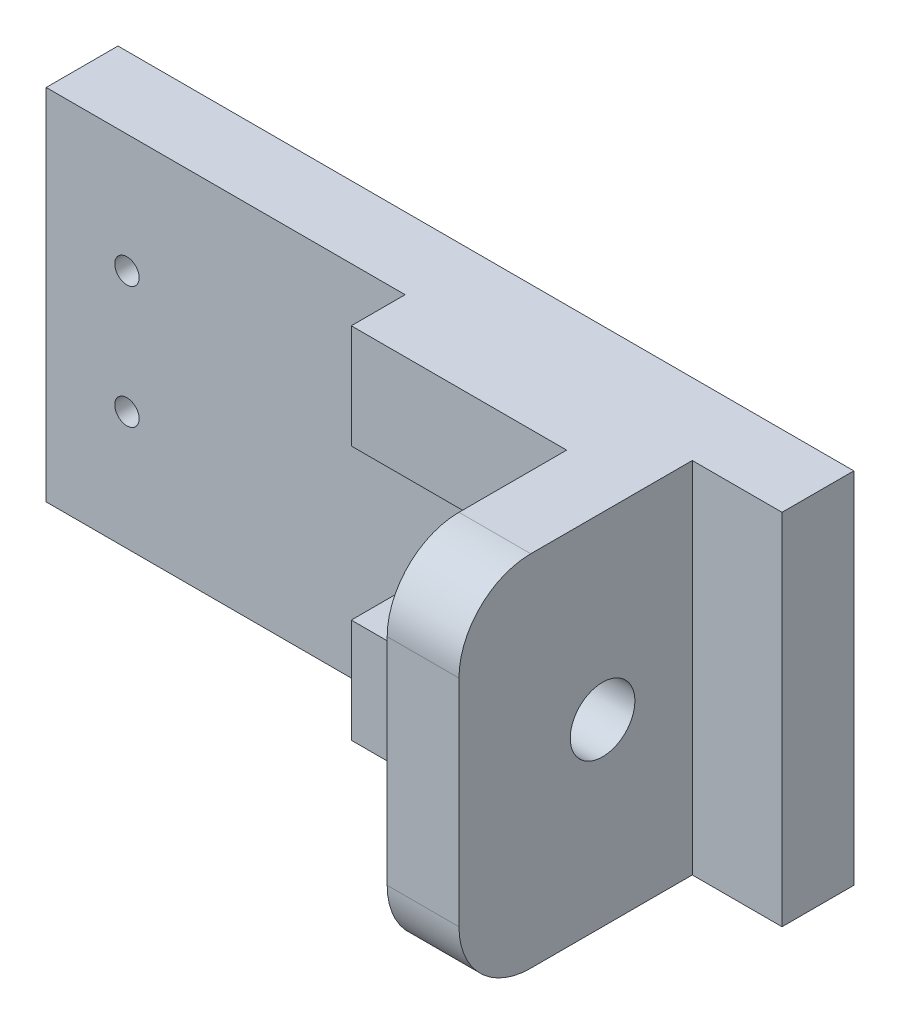
ISO-10303-21;
HEADER;
FILE_DESCRIPTION(('STEP AP214'),'2;1');
FILE_NAME('part.step','',(''),(''),'','','');
FILE_SCHEMA(('AUTOMOTIVE_DESIGN { 1 0 10303 214 1 1 1 1 }'));
ENDSEC;
DATA;
#1=APPLICATION_CONTEXT('core data for automotive mechanical design processes');
#2=APPLICATION_PROTOCOL_DEFINITION('international standard','automotive_design',2000,#1);
#3=PRODUCT_CONTEXT('',#1,'mechanical');
#4=PRODUCT('Part','Part','',(#3));
#5=PRODUCT_RELATED_PRODUCT_CATEGORY('part','',(#4));
#6=PRODUCT_DEFINITION_FORMATION('','',#4);
#7=PRODUCT_DEFINITION_CONTEXT('part definition',#1,'design');
#8=PRODUCT_DEFINITION('design','',#6,#7);
#9=PRODUCT_DEFINITION_SHAPE('','',#8);
#10=(LENGTH_UNIT() NAMED_UNIT(*) SI_UNIT(.MILLI.,.METRE.));
#11=(NAMED_UNIT(*) PLANE_ANGLE_UNIT() SI_UNIT($,.RADIAN.));
#12=(NAMED_UNIT(*) SI_UNIT($,.STERADIAN.) SOLID_ANGLE_UNIT());
#13=UNCERTAINTY_MEASURE_WITH_UNIT(LENGTH_MEASURE(1.E-05),#10,'distance_accuracy_value','');
#14=(GEOMETRIC_REPRESENTATION_CONTEXT(3) GLOBAL_UNCERTAINTY_ASSIGNED_CONTEXT((#13)) GLOBAL_UNIT_ASSIGNED_CONTEXT((#10,
#11,#12)) REPRESENTATION_CONTEXT('',''));
#15=CARTESIAN_POINT('',(0.,0.,0.));
#16=DIRECTION('',(0.,0.,1.));
#17=DIRECTION('',(1.,0.,0.));
#18=AXIS2_PLACEMENT_3D('',#15,#16,#17);
#19=CARTESIAN_POINT('',(0.,0.,20.));
#20=DIRECTION('',(0.,0.,1.));
#21=DIRECTION('',(1.,0.,0.));
#22=AXIS2_PLACEMENT_3D('',#19,#20,#21);
#23=PLANE('',#22);
#24=CARTESIAN_POINT('',(-80.,17.,20.));
#25=DIRECTION('',(0.,0.,1.));
#26=DIRECTION('',(1.,0.,0.));
#27=AXIS2_PLACEMENT_3D('',#24,#25,#26);
#28=CIRCLE('',#27,3.39999999999999);
#29=CARTESIAN_POINT('',(-76.6,17.,20.));
#30=VERTEX_POINT('',#29);
#31=EDGE_CURVE('E356',#30,#30,#28,.T.);
#32=ORIENTED_EDGE('',*,*,#31,.F.);
#33=EDGE_LOOP('',(#32));
#34=FACE_BOUND('',#33,.T.);
#35=CARTESIAN_POINT('',(-80.,-17.,20.));
#36=DIRECTION('',(0.,0.,1.));
#37=DIRECTION('',(1.,0.,0.));
#38=AXIS2_PLACEMENT_3D('',#35,#36,#37);
#39=CIRCLE('',#38,3.39999999999999);
#40=CARTESIAN_POINT('',(-76.6,-17.,20.));
#41=VERTEX_POINT('',#40);
#42=EDGE_CURVE('E359',#41,#41,#39,.T.);
#43=ORIENTED_EDGE('',*,*,#42,.F.);
#44=EDGE_LOOP('',(#43));
#45=FACE_BOUND('',#44,.T.);
#46=DIRECTION('',(1.,0.,0.));
#47=VECTOR('',#46,1.);
#48=CARTESIAN_POINT('',(57.5,21.,20.));
#49=LINE('',#48,#47);
#50=CARTESIAN_POINT('',(-2.49999999999997,21.,20.));
#51=VERTEX_POINT('',#50);
#52=CARTESIAN_POINT('',(57.5,21.,20.));
#53=VERTEX_POINT('',#52);
#54=EDGE_CURVE('E57',#51,#53,#49,.T.);
#55=ORIENTED_EDGE('',*,*,#54,.F.);
#56=DIRECTION('',(0.,-1.,0.));
#57=VECTOR('',#56,1.);
#58=CARTESIAN_POINT('',(-2.49999999999997,50.,20.));
#59=LINE('',#58,#57);
#60=CARTESIAN_POINT('',(-2.49999999999997,50.,20.));
#61=VERTEX_POINT('',#60);
#62=EDGE_CURVE('E183',#61,#51,#59,.T.);
#63=ORIENTED_EDGE('',*,*,#62,.F.);
#64=DIRECTION('',(-1.,0.,0.));
#65=VECTOR('',#64,1.);
#66=CARTESIAN_POINT('',(102.5,50.,20.));
#67=LINE('',#66,#65);
#68=CARTESIAN_POINT('',(-102.5,50.,20.));
#69=VERTEX_POINT('',#68);
#70=EDGE_CURVE('E169',#61,#69,#67,.T.);
#71=ORIENTED_EDGE('',*,*,#70,.T.);
#72=DIRECTION('',(0.,-1.,0.));
#73=VECTOR('',#72,1.);
#74=CARTESIAN_POINT('',(-102.5,-50.,20.));
#75=LINE('',#74,#73);
#76=CARTESIAN_POINT('',(-102.5,-50.,20.));
#77=VERTEX_POINT('',#76);
#78=EDGE_CURVE('E257',#69,#77,#75,.T.);
#79=ORIENTED_EDGE('',*,*,#78,.T.);
#80=DIRECTION('',(1.,0.,0.));
#81=VECTOR('',#80,1.);
#82=CARTESIAN_POINT('',(102.5,-50.,20.));
#83=LINE('',#82,#81);
#84=CARTESIAN_POINT('',(-2.49999999999999,-50.,20.));
#85=VERTEX_POINT('',#84);
#86=EDGE_CURVE('E262',#77,#85,#83,.T.);
#87=ORIENTED_EDGE('',*,*,#86,.T.);
#88=DIRECTION('',(0.,-1.,0.));
#89=VECTOR('',#88,1.);
#90=CARTESIAN_POINT('',(-2.49999999999999,-50.,20.));
#91=LINE('',#90,#89);
#92=CARTESIAN_POINT('',(-2.49999999999999,-21.,20.));
#93=VERTEX_POINT('',#92);
#94=EDGE_CURVE('E193',#93,#85,#91,.T.);
#95=ORIENTED_EDGE('',*,*,#94,.F.);
#96=DIRECTION('',(-1.,0.,0.));
#97=VECTOR('',#96,1.);
#98=CARTESIAN_POINT('',(57.5,-21.,20.));
#99=LINE('',#98,#97);
#100=CARTESIAN_POINT('',(57.5,-21.,20.));
#101=VERTEX_POINT('',#100);
#102=EDGE_CURVE('E171',#101,#93,#99,.T.);
#103=ORIENTED_EDGE('',*,*,#102,.F.);
#104=DIRECTION('',(0.,-1.,0.));
#105=VECTOR('',#104,1.);
#106=CARTESIAN_POINT('',(57.5,-50.,20.));
#107=LINE('',#106,#105);
#108=EDGE_CURVE('E226',#53,#101,#107,.T.);
#109=ORIENTED_EDGE('',*,*,#108,.F.);
#110=EDGE_LOOP('',(#55,#63,#71,#79,#87,#95,#103,#109));
#111=FACE_BOUND('',#110,.T.);
#112=ADVANCED_FACE('F42',(#34,#45,#111),#23,.T.);
#113=CARTESIAN_POINT('',(57.5,-50.,85.));
#114=DIRECTION('',(1.,0.,0.));
#115=DIRECTION('',(0.,0.,-1.));
#116=AXIS2_PLACEMENT_3D('',#113,#114,#115);
#117=PLANE('',#116);
#118=CARTESIAN_POINT('',(57.5,0.,45.));
#119=DIRECTION('',(-1.,0.,0.));
#120=DIRECTION('',(0.,0.,1.));
#121=AXIS2_PLACEMENT_3D('',#118,#119,#120);
#122=CIRCLE('',#121,9.);
#123=CARTESIAN_POINT('',(57.5,0.,54.));
#124=VERTEX_POINT('',#123);
#125=EDGE_CURVE('E210',#124,#124,#122,.T.);
#126=ORIENTED_EDGE('',*,*,#125,.F.);
#127=EDGE_LOOP('',(#126));
#128=FACE_BOUND('',#127,.T.);
#129=DIRECTION('',(0.,0.,-1.));
#130=VECTOR('',#129,1.);
#131=CARTESIAN_POINT('',(57.5,21.,35.));
#132=LINE('',#131,#130);
#133=CARTESIAN_POINT('',(57.5,21.,35.));
#134=VERTEX_POINT('',#133);
#135=EDGE_CURVE('E179',#134,#53,#132,.T.);
#136=ORIENTED_EDGE('',*,*,#135,.T.);
#137=ORIENTED_EDGE('',*,*,#108,.T.);
#138=DIRECTION('',(0.,0.,-1.));
#139=VECTOR('',#138,1.);
#140=CARTESIAN_POINT('',(57.5,-21.,35.));
#141=LINE('',#140,#139);
#142=CARTESIAN_POINT('',(57.5,-21.,35.));
#143=VERTEX_POINT('',#142);
#144=EDGE_CURVE('E207',#143,#101,#141,.T.);
#145=ORIENTED_EDGE('',*,*,#144,.F.);
#146=DIRECTION('',(0.,1.,0.));
#147=VECTOR('',#146,1.);
#148=CARTESIAN_POINT('',(57.5,-50.,35.));
#149=LINE('',#148,#147);
#150=CARTESIAN_POINT('',(57.5,-50.,35.));
#151=VERTEX_POINT('',#150);
#152=EDGE_CURVE('E189',#151,#143,#149,.T.);
#153=ORIENTED_EDGE('',*,*,#152,.F.);
#154=DIRECTION('',(0.,0.,-1.));
#155=VECTOR('',#154,1.);
#156=CARTESIAN_POINT('',(57.5,-50.,85.));
#157=LINE('',#156,#155);
#158=CARTESIAN_POINT('',(57.5,-50.,65.));
#159=VERTEX_POINT('',#158);
#160=EDGE_CURVE('E253',#159,#151,#157,.T.);
#161=ORIENTED_EDGE('',*,*,#160,.F.);
#162=CARTESIAN_POINT('',(57.5,-30.,65.));
#163=DIRECTION('',(1.,0.,0.));
#164=DIRECTION('',(0.,0.,1.));
#165=AXIS2_PLACEMENT_3D('',#162,#163,#164);
#166=CIRCLE('',#165,20.);
#167=CARTESIAN_POINT('',(57.5,-30.,85.));
#168=VERTEX_POINT('',#167);
#169=EDGE_CURVE('E214',#168,#159,#166,.T.);
#170=ORIENTED_EDGE('',*,*,#169,.F.);
#171=DIRECTION('',(0.,-1.,0.));
#172=VECTOR('',#171,1.);
#173=CARTESIAN_POINT('',(57.5,-50.,85.));
#174=LINE('',#173,#172);
#175=CARTESIAN_POINT('',(57.5,30.,85.));
#176=VERTEX_POINT('',#175);
#177=EDGE_CURVE('E237',#176,#168,#174,.T.);
#178=ORIENTED_EDGE('',*,*,#177,.F.);
#179=CARTESIAN_POINT('',(57.5,30.,65.));
#180=DIRECTION('',(1.,0.,0.));
#181=DIRECTION('',(0.,0.,1.));
#182=AXIS2_PLACEMENT_3D('',#179,#180,#181);
#183=CIRCLE('',#182,20.);
#184=CARTESIAN_POINT('',(57.5,50.,65.));
#185=VERTEX_POINT('',#184);
#186=EDGE_CURVE('E221',#185,#176,#183,.T.);
#187=ORIENTED_EDGE('',*,*,#186,.F.);
#188=DIRECTION('',(0.,0.,-1.));
#189=VECTOR('',#188,1.);
#190=CARTESIAN_POINT('',(57.5,50.,85.));
#191=LINE('',#190,#189);
#192=CARTESIAN_POINT('',(57.5,50.,35.));
#193=VERTEX_POINT('',#192);
#194=EDGE_CURVE('E244',#185,#193,#191,.T.);
#195=ORIENTED_EDGE('',*,*,#194,.T.);
#196=DIRECTION('',(0.,1.,0.));
#197=VECTOR('',#196,1.);
#198=CARTESIAN_POINT('',(57.5,50.,35.));
#199=LINE('',#198,#197);
#200=EDGE_CURVE('E65',#134,#193,#199,.T.);
#201=ORIENTED_EDGE('',*,*,#200,.F.);
#202=EDGE_LOOP('',(#136,#137,#145,#153,#161,#170,#178,#187,#195,#201));
#203=FACE_BOUND('',#202,.T.);
#204=ADVANCED_FACE('F303',(#128,#203),#117,.F.);
#205=CARTESIAN_POINT('',(102.5,-50.,20.));
#206=DIRECTION('',(0.,1.,0.));
#207=DIRECTION('',(-1.,0.,0.));
#208=AXIS2_PLACEMENT_3D('',#205,#206,#207);
#209=PLANE('',#208);
#210=DIRECTION('',(-1.,0.,0.));
#211=VECTOR('',#210,1.);
#212=CARTESIAN_POINT('',(77.5,-50.,65.));
#213=LINE('',#212,#211);
#214=CARTESIAN_POINT('',(77.5,-50.,65.));
#215=VERTEX_POINT('',#214);
#216=EDGE_CURVE('E232',#215,#159,#213,.T.);
#217=ORIENTED_EDGE('',*,*,#216,.T.);
#218=ORIENTED_EDGE('',*,*,#160,.T.);
#219=DIRECTION('',(1.,0.,0.));
#220=VECTOR('',#219,1.);
#221=CARTESIAN_POINT('',(57.5,-50.,35.));
#222=LINE('',#221,#220);
#223=CARTESIAN_POINT('',(-2.49999999999999,-50.,35.));
#224=VERTEX_POINT('',#223);
#225=EDGE_CURVE('E197',#224,#151,#222,.T.);
#226=ORIENTED_EDGE('',*,*,#225,.F.);
#227=DIRECTION('',(0.,0.,-1.));
#228=VECTOR('',#227,1.);
#229=CARTESIAN_POINT('',(-2.49999999999999,-50.,35.));
#230=LINE('',#229,#228);
#231=EDGE_CURVE('E199',#224,#85,#230,.T.);
#232=ORIENTED_EDGE('',*,*,#231,.T.);
#233=ORIENTED_EDGE('',*,*,#86,.F.);
#234=DIRECTION('',(0.,0.,-1.));
#235=VECTOR('',#234,1.);
#236=CARTESIAN_POINT('',(-102.5,-50.,20.));
#237=LINE('',#236,#235);
#238=CARTESIAN_POINT('',(-102.5,-50.,0.));
#239=VERTEX_POINT('',#238);
#240=EDGE_CURVE('E11',#77,#239,#237,.T.);
#241=ORIENTED_EDGE('',*,*,#240,.T.);
#242=DIRECTION('',(1.,0.,0.));
#243=VECTOR('',#242,1.);
#244=CARTESIAN_POINT('',(102.5,-50.,0.));
#245=LINE('',#244,#243);
#246=CARTESIAN_POINT('',(102.5,-50.,0.));
#247=VERTEX_POINT('',#246);
#248=EDGE_CURVE('E273',#239,#247,#245,.T.);
#249=ORIENTED_EDGE('',*,*,#248,.T.);
#250=DIRECTION('',(0.,0.,-1.));
#251=VECTOR('',#250,1.);
#252=CARTESIAN_POINT('',(102.5,-50.,20.));
#253=LINE('',#252,#251);
#254=CARTESIAN_POINT('',(102.5,-50.,20.));
#255=VERTEX_POINT('',#254);
#256=EDGE_CURVE('E50',#255,#247,#253,.T.);
#257=ORIENTED_EDGE('',*,*,#256,.F.);
#258=CARTESIAN_POINT('',(77.5,-50.,20.));
#259=VERTEX_POINT('',#258);
#260=EDGE_CURVE('E260',#259,#255,#83,.T.);
#261=ORIENTED_EDGE('',*,*,#260,.F.);
#262=DIRECTION('',(0.,0.,-1.));
#263=VECTOR('',#262,1.);
#264=CARTESIAN_POINT('',(77.5,-50.,85.));
#265=LINE('',#264,#263);
#266=EDGE_CURVE('E251',#215,#259,#265,.T.);
#267=ORIENTED_EDGE('',*,*,#266,.F.);
#268=EDGE_LOOP('',(#217,#218,#226,#232,#233,#241,#249,#257,#261,#267));
#269=FACE_BOUND('',#268,.T.);
#270=ADVANCED_FACE('F319',(#269),#209,.F.);
#271=CARTESIAN_POINT('',(0.,0.,85.));
#272=DIRECTION('',(0.,0.,1.));
#273=DIRECTION('',(1.,0.,0.));
#274=AXIS2_PLACEMENT_3D('',#271,#272,#273);
#275=PLANE('',#274);
#276=DIRECTION('',(-1.,0.,0.));
#277=VECTOR('',#276,1.);
#278=CARTESIAN_POINT('',(77.5,30.,85.));
#279=LINE('',#278,#277);
#280=CARTESIAN_POINT('',(77.5,30.,85.));
#281=VERTEX_POINT('',#280);
#282=EDGE_CURVE('E220',#281,#176,#279,.T.);
#283=ORIENTED_EDGE('',*,*,#282,.T.);
#284=ORIENTED_EDGE('',*,*,#177,.T.);
#285=DIRECTION('',(-1.,0.,0.));
#286=VECTOR('',#285,1.);
#287=CARTESIAN_POINT('',(77.5,-30.,85.));
#288=LINE('',#287,#286);
#289=CARTESIAN_POINT('',(77.5,-30.,85.));
#290=VERTEX_POINT('',#289);
#291=EDGE_CURVE('E223',#290,#168,#288,.T.);
#292=ORIENTED_EDGE('',*,*,#291,.F.);
#293=DIRECTION('',(0.,1.,0.));
#294=VECTOR('',#293,1.);
#295=CARTESIAN_POINT('',(77.5,-50.,85.));
#296=LINE('',#295,#294);
#297=EDGE_CURVE('E240',#290,#281,#296,.T.);
#298=ORIENTED_EDGE('',*,*,#297,.T.);
#299=EDGE_LOOP('',(#283,#284,#292,#298));
#300=FACE_BOUND('',#299,.T.);
#301=ADVANCED_FACE('F330',(#300),#275,.T.);
#302=CARTESIAN_POINT('',(-102.5,-50.,20.));
#303=DIRECTION('',(1.,0.,0.));
#304=DIRECTION('',(0.,0.,-1.));
#305=AXIS2_PLACEMENT_3D('',#302,#303,#304);
#306=PLANE('',#305);
#307=DIRECTION('',(0.,-1.,0.));
#308=VECTOR('',#307,1.);
#309=CARTESIAN_POINT('',(-102.5,-50.,0.));
#310=LINE('',#309,#308);
#311=CARTESIAN_POINT('',(-102.5,50.,0.));
#312=VERTEX_POINT('',#311);
#313=EDGE_CURVE('E256',#312,#239,#310,.T.);
#314=ORIENTED_EDGE('',*,*,#313,.T.);
#315=ORIENTED_EDGE('',*,*,#240,.F.);
#316=ORIENTED_EDGE('',*,*,#78,.F.);
#317=DIRECTION('',(0.,0.,-1.));
#318=VECTOR('',#317,1.);
#319=CARTESIAN_POINT('',(-102.5,50.,20.));
#320=LINE('',#319,#318);
#321=EDGE_CURVE('E270',#69,#312,#320,.T.);
#322=ORIENTED_EDGE('',*,*,#321,.T.);
#323=EDGE_LOOP('',(#314,#315,#316,#322));
#324=FACE_BOUND('',#323,.T.);
#325=ADVANCED_FACE('F44',(#324),#306,.F.);
#326=CARTESIAN_POINT('',(102.5,-50.,20.));
#327=DIRECTION('',(-1.,0.,0.));
#328=DIRECTION('',(0.,0.,1.));
#329=AXIS2_PLACEMENT_3D('',#326,#327,#328);
#330=PLANE('',#329);
#331=DIRECTION('',(0.,1.,0.));
#332=VECTOR('',#331,1.);
#333=CARTESIAN_POINT('',(102.5,-50.,0.));
#334=LINE('',#333,#332);
#335=CARTESIAN_POINT('',(102.5,50.,0.));
#336=VERTEX_POINT('',#335);
#337=EDGE_CURVE('E275',#247,#336,#334,.T.);
#338=ORIENTED_EDGE('',*,*,#337,.T.);
#339=DIRECTION('',(0.,0.,-1.));
#340=VECTOR('',#339,1.);
#341=CARTESIAN_POINT('',(102.5,50.,20.));
#342=LINE('',#341,#340);
#343=CARTESIAN_POINT('',(102.5,50.,20.));
#344=VERTEX_POINT('',#343);
#345=EDGE_CURVE('E280',#344,#336,#342,.T.);
#346=ORIENTED_EDGE('',*,*,#345,.F.);
#347=DIRECTION('',(0.,1.,0.));
#348=VECTOR('',#347,1.);
#349=CARTESIAN_POINT('',(102.5,-50.,20.));
#350=LINE('',#349,#348);
#351=EDGE_CURVE('E265',#255,#344,#350,.T.);
#352=ORIENTED_EDGE('',*,*,#351,.F.);
#353=ORIENTED_EDGE('',*,*,#256,.T.);
#354=EDGE_LOOP('',(#338,#346,#352,#353));
#355=FACE_BOUND('',#354,.T.);
#356=ADVANCED_FACE('F287',(#355),#330,.F.);
#357=CARTESIAN_POINT('',(102.5,50.,20.));
#358=DIRECTION('',(0.,-1.,0.));
#359=DIRECTION('',(1.,0.,0.));
#360=AXIS2_PLACEMENT_3D('',#357,#358,#359);
#361=PLANE('',#360);
#362=ORIENTED_EDGE('',*,*,#194,.F.);
#363=DIRECTION('',(-1.,0.,0.));
#364=VECTOR('',#363,1.);
#365=CARTESIAN_POINT('',(77.5,50.,65.));
#366=LINE('',#365,#364);
#367=CARTESIAN_POINT('',(77.5,50.,65.));
#368=VERTEX_POINT('',#367);
#369=EDGE_CURVE('E224',#368,#185,#366,.T.);
#370=ORIENTED_EDGE('',*,*,#369,.F.);
#371=DIRECTION('',(0.,0.,-1.));
#372=VECTOR('',#371,1.);
#373=CARTESIAN_POINT('',(77.5,50.,85.));
#374=LINE('',#373,#372);
#375=CARTESIAN_POINT('',(77.5,50.,20.));
#376=VERTEX_POINT('',#375);
#377=EDGE_CURVE('E249',#368,#376,#374,.T.);
#378=ORIENTED_EDGE('',*,*,#377,.T.);
#379=EDGE_CURVE('E267',#344,#376,#67,.T.);
#380=ORIENTED_EDGE('',*,*,#379,.F.);
#381=ORIENTED_EDGE('',*,*,#345,.T.);
#382=DIRECTION('',(-1.,0.,0.));
#383=VECTOR('',#382,1.);
#384=CARTESIAN_POINT('',(102.5,50.,0.));
#385=LINE('',#384,#383);
#386=EDGE_CURVE('E261',#336,#312,#385,.T.);
#387=ORIENTED_EDGE('',*,*,#386,.T.);
#388=ORIENTED_EDGE('',*,*,#321,.F.);
#389=ORIENTED_EDGE('',*,*,#70,.F.);
#390=DIRECTION('',(0.,0.,-1.));
#391=VECTOR('',#390,1.);
#392=CARTESIAN_POINT('',(-2.49999999999997,50.,35.));
#393=LINE('',#392,#391);
#394=CARTESIAN_POINT('',(-2.49999999999997,50.,35.));
#395=VERTEX_POINT('',#394);
#396=EDGE_CURVE('E166',#395,#61,#393,.T.);
#397=ORIENTED_EDGE('',*,*,#396,.F.);
#398=DIRECTION('',(-1.,0.,0.));
#399=VECTOR('',#398,1.);
#400=CARTESIAN_POINT('',(57.5,50.,35.));
#401=LINE('',#400,#399);
#402=EDGE_CURVE('E156',#193,#395,#401,.T.);
#403=ORIENTED_EDGE('',*,*,#402,.F.);
#404=EDGE_LOOP('',(#362,#370,#378,#380,#381,#387,#388,#389,#397,#403));
#405=FACE_BOUND('',#404,.T.);
#406=ADVANCED_FACE('F167',(#405),#361,.F.);
#407=DIRECTION('',(0.,1.,0.));
#408=VECTOR('',#407,1.);
#409=CARTESIAN_POINT('',(77.5,-50.,20.));
#410=LINE('',#409,#408);
#411=EDGE_CURVE('E241',#259,#376,#410,.T.);
#412=ORIENTED_EDGE('',*,*,#411,.F.);
#413=ORIENTED_EDGE('',*,*,#260,.T.);
#414=ORIENTED_EDGE('',*,*,#351,.T.);
#415=ORIENTED_EDGE('',*,*,#379,.T.);
#416=EDGE_LOOP('',(#412,#413,#414,#415));
#417=FACE_BOUND('',#416,.T.);
#418=ADVANCED_FACE('F336',(#417),#23,.T.);
#419=CARTESIAN_POINT('',(0.,0.,0.));
#420=DIRECTION('',(0.,0.,1.));
#421=DIRECTION('',(1.,0.,0.));
#422=AXIS2_PLACEMENT_3D('',#419,#420,#421);
#423=PLANE('',#422);
#424=CARTESIAN_POINT('',(-80.,17.,0.));
#425=DIRECTION('',(0.,0.,1.));
#426=DIRECTION('',(1.,0.,0.));
#427=AXIS2_PLACEMENT_3D('',#424,#425,#426);
#428=CIRCLE('',#427,3.39999999999999);
#429=CARTESIAN_POINT('',(-76.6,17.,0.));
#430=VERTEX_POINT('',#429);
#431=EDGE_CURVE('E361',#430,#430,#428,.T.);
#432=ORIENTED_EDGE('',*,*,#431,.T.);
#433=EDGE_LOOP('',(#432));
#434=FACE_BOUND('',#433,.T.);
#435=CARTESIAN_POINT('',(-80.,-17.,0.));
#436=DIRECTION('',(0.,0.,1.));
#437=DIRECTION('',(1.,0.,0.));
#438=AXIS2_PLACEMENT_3D('',#435,#436,#437);
#439=CIRCLE('',#438,3.39999999999999);
#440=CARTESIAN_POINT('',(-76.6,-17.,0.));
#441=VERTEX_POINT('',#440);
#442=EDGE_CURVE('E185',#441,#441,#439,.T.);
#443=ORIENTED_EDGE('',*,*,#442,.T.);
#444=EDGE_LOOP('',(#443));
#445=FACE_BOUND('',#444,.T.);
#446=ORIENTED_EDGE('',*,*,#313,.F.);
#447=ORIENTED_EDGE('',*,*,#386,.F.);
#448=ORIENTED_EDGE('',*,*,#337,.F.);
#449=ORIENTED_EDGE('',*,*,#248,.F.);
#450=EDGE_LOOP('',(#446,#447,#448,#449));
#451=FACE_BOUND('',#450,.T.);
#452=ADVANCED_FACE('F294',(#434,#445,#451),#423,.F.);
#453=CARTESIAN_POINT('',(77.5,-50.,85.));
#454=DIRECTION('',(-1.,0.,0.));
#455=DIRECTION('',(0.,0.,1.));
#456=AXIS2_PLACEMENT_3D('',#453,#454,#455);
#457=PLANE('',#456);
#458=CARTESIAN_POINT('',(77.5,0.,45.));
#459=DIRECTION('',(-1.,0.,0.));
#460=DIRECTION('',(0.,0.,1.));
#461=AXIS2_PLACEMENT_3D('',#458,#459,#460);
#462=CIRCLE('',#461,9.);
#463=CARTESIAN_POINT('',(77.5,0.,54.));
#464=VERTEX_POINT('',#463);
#465=EDGE_CURVE('E211',#464,#464,#462,.T.);
#466=ORIENTED_EDGE('',*,*,#465,.T.);
#467=EDGE_LOOP('',(#466));
#468=FACE_BOUND('',#467,.T.);
#469=ORIENTED_EDGE('',*,*,#377,.F.);
#470=CARTESIAN_POINT('',(77.5,30.,65.));
#471=DIRECTION('',(1.,0.,0.));
#472=DIRECTION('',(0.,0.,1.));
#473=AXIS2_PLACEMENT_3D('',#470,#471,#472);
#474=CIRCLE('',#473,20.);
#475=EDGE_CURVE('E217',#368,#281,#474,.T.);
#476=ORIENTED_EDGE('',*,*,#475,.T.);
#477=ORIENTED_EDGE('',*,*,#297,.F.);
#478=CARTESIAN_POINT('',(77.5,-30.,65.));
#479=DIRECTION('',(1.,0.,0.));
#480=DIRECTION('',(0.,0.,1.));
#481=AXIS2_PLACEMENT_3D('',#478,#479,#480);
#482=CIRCLE('',#481,20.);
#483=EDGE_CURVE('E229',#290,#215,#482,.T.);
#484=ORIENTED_EDGE('',*,*,#483,.T.);
#485=ORIENTED_EDGE('',*,*,#266,.T.);
#486=ORIENTED_EDGE('',*,*,#411,.T.);
#487=EDGE_LOOP('',(#469,#476,#477,#484,#485,#486));
#488=FACE_BOUND('',#487,.T.);
#489=ADVANCED_FACE('F327',(#468,#488),#457,.F.);
#490=CARTESIAN_POINT('',(77.5,-30.,65.));
#491=DIRECTION('',(-1.,0.,0.));
#492=DIRECTION('',(0.,0.,1.));
#493=AXIS2_PLACEMENT_3D('',#490,#491,#492);
#494=CYLINDRICAL_SURFACE('',#493,20.);
#495=ORIENTED_EDGE('',*,*,#169,.T.);
#496=ORIENTED_EDGE('',*,*,#216,.F.);
#497=ORIENTED_EDGE('',*,*,#483,.F.);
#498=ORIENTED_EDGE('',*,*,#291,.T.);
#499=EDGE_LOOP('',(#495,#496,#497,#498));
#500=FACE_BOUND('',#499,.T.);
#501=ADVANCED_FACE('F322',(#500),#494,.T.);
#502=CARTESIAN_POINT('',(77.5,30.,65.));
#503=DIRECTION('',(-1.,0.,0.));
#504=DIRECTION('',(0.,0.,1.));
#505=AXIS2_PLACEMENT_3D('',#502,#503,#504);
#506=CYLINDRICAL_SURFACE('',#505,20.);
#507=ORIENTED_EDGE('',*,*,#186,.T.);
#508=ORIENTED_EDGE('',*,*,#282,.F.);
#509=ORIENTED_EDGE('',*,*,#475,.F.);
#510=ORIENTED_EDGE('',*,*,#369,.T.);
#511=EDGE_LOOP('',(#507,#508,#509,#510));
#512=FACE_BOUND('',#511,.T.);
#513=ADVANCED_FACE('F396',(#512),#506,.T.);
#514=CARTESIAN_POINT('',(77.5,0.,45.));
#515=DIRECTION('',(-1.,0.,0.));
#516=DIRECTION('',(0.,0.,1.));
#517=AXIS2_PLACEMENT_3D('',#514,#515,#516);
#518=CYLINDRICAL_SURFACE('',#517,9.);
#519=ORIENTED_EDGE('',*,*,#465,.F.);
#520=EDGE_LOOP('',(#519));
#521=FACE_BOUND('',#520,.T.);
#522=ORIENTED_EDGE('',*,*,#125,.T.);
#523=EDGE_LOOP('',(#522));
#524=FACE_BOUND('',#523,.T.);
#525=ADVANCED_FACE('F393',(#521,#524),#518,.F.);
#526=CARTESIAN_POINT('',(57.5,-21.,35.));
#527=DIRECTION('',(0.,-1.,0.));
#528=DIRECTION('',(1.,0.,0.));
#529=AXIS2_PLACEMENT_3D('',#526,#527,#528);
#530=PLANE('',#529);
#531=ORIENTED_EDGE('',*,*,#102,.T.);
#532=DIRECTION('',(0.,0.,-1.));
#533=VECTOR('',#532,1.);
#534=CARTESIAN_POINT('',(-2.49999999999999,-21.,35.));
#535=LINE('',#534,#533);
#536=CARTESIAN_POINT('',(-2.49999999999999,-21.,35.));
#537=VERTEX_POINT('',#536);
#538=EDGE_CURVE('E204',#537,#93,#535,.T.);
#539=ORIENTED_EDGE('',*,*,#538,.F.);
#540=DIRECTION('',(-1.,0.,0.));
#541=VECTOR('',#540,1.);
#542=CARTESIAN_POINT('',(57.5,-21.,35.));
#543=LINE('',#542,#541);
#544=EDGE_CURVE('E192',#143,#537,#543,.T.);
#545=ORIENTED_EDGE('',*,*,#544,.F.);
#546=ORIENTED_EDGE('',*,*,#144,.T.);
#547=EDGE_LOOP('',(#531,#539,#545,#546));
#548=FACE_BOUND('',#547,.T.);
#549=ADVANCED_FACE('F308',(#548),#530,.F.);
#550=CARTESIAN_POINT('',(-2.49999999999999,-50.,35.));
#551=DIRECTION('',(1.,0.,0.));
#552=DIRECTION('',(0.,0.,-1.));
#553=AXIS2_PLACEMENT_3D('',#550,#551,#552);
#554=PLANE('',#553);
#555=ORIENTED_EDGE('',*,*,#94,.T.);
#556=ORIENTED_EDGE('',*,*,#231,.F.);
#557=DIRECTION('',(0.,-1.,0.));
#558=VECTOR('',#557,1.);
#559=CARTESIAN_POINT('',(-2.49999999999999,-50.,35.));
#560=LINE('',#559,#558);
#561=EDGE_CURVE('E195',#537,#224,#560,.T.);
#562=ORIENTED_EDGE('',*,*,#561,.F.);
#563=ORIENTED_EDGE('',*,*,#538,.T.);
#564=EDGE_LOOP('',(#555,#556,#562,#563));
#565=FACE_BOUND('',#564,.T.);
#566=ADVANCED_FACE('F311',(#565),#554,.F.);
#567=CARTESIAN_POINT('',(0.,0.,35.));
#568=DIRECTION('',(0.,0.,1.));
#569=DIRECTION('',(1.,0.,0.));
#570=AXIS2_PLACEMENT_3D('',#567,#568,#569);
#571=PLANE('',#570);
#572=ORIENTED_EDGE('',*,*,#152,.T.);
#573=ORIENTED_EDGE('',*,*,#544,.T.);
#574=ORIENTED_EDGE('',*,*,#561,.T.);
#575=ORIENTED_EDGE('',*,*,#225,.T.);
#576=EDGE_LOOP('',(#572,#573,#574,#575));
#577=FACE_BOUND('',#576,.T.);
#578=ADVANCED_FACE('F315',(#577),#571,.T.);
#579=CARTESIAN_POINT('',(-2.49999999999997,50.,35.));
#580=DIRECTION('',(1.,0.,0.));
#581=DIRECTION('',(0.,1.,0.));
#582=AXIS2_PLACEMENT_3D('',#579,#580,#581);
#583=PLANE('',#582);
#584=ORIENTED_EDGE('',*,*,#62,.T.);
#585=DIRECTION('',(0.,0.,-1.));
#586=VECTOR('',#585,1.);
#587=CARTESIAN_POINT('',(-2.49999999999997,21.,35.));
#588=LINE('',#587,#586);
#589=CARTESIAN_POINT('',(-2.49999999999997,21.,35.));
#590=VERTEX_POINT('',#589);
#591=EDGE_CURVE('E172',#590,#51,#588,.T.);
#592=ORIENTED_EDGE('',*,*,#591,.F.);
#593=DIRECTION('',(0.,-1.,0.));
#594=VECTOR('',#593,1.);
#595=CARTESIAN_POINT('',(-2.49999999999997,50.,35.));
#596=LINE('',#595,#594);
#597=EDGE_CURVE('E160',#395,#590,#596,.T.);
#598=ORIENTED_EDGE('',*,*,#597,.F.);
#599=ORIENTED_EDGE('',*,*,#396,.T.);
#600=EDGE_LOOP('',(#584,#592,#598,#599));
#601=FACE_BOUND('',#600,.T.);
#602=ADVANCED_FACE('F174',(#601),#583,.F.);
#603=CARTESIAN_POINT('',(57.5,21.,35.));
#604=DIRECTION('',(0.,1.,0.));
#605=DIRECTION('',(-1.,0.,0.));
#606=AXIS2_PLACEMENT_3D('',#603,#604,#605);
#607=PLANE('',#606);
#608=ORIENTED_EDGE('',*,*,#54,.T.);
#609=ORIENTED_EDGE('',*,*,#135,.F.);
#610=DIRECTION('',(1.,0.,0.));
#611=VECTOR('',#610,1.);
#612=CARTESIAN_POINT('',(57.5,21.,35.));
#613=LINE('',#612,#611);
#614=EDGE_CURVE('E177',#590,#134,#613,.T.);
#615=ORIENTED_EDGE('',*,*,#614,.F.);
#616=ORIENTED_EDGE('',*,*,#591,.T.);
#617=EDGE_LOOP('',(#608,#609,#615,#616));
#618=FACE_BOUND('',#617,.T.);
#619=ADVANCED_FACE('F301',(#618),#607,.F.);
#620=CARTESIAN_POINT('',(0.,0.,35.));
#621=DIRECTION('',(0.,0.,-1.));
#622=DIRECTION('',(-1.,0.,0.));
#623=AXIS2_PLACEMENT_3D('',#620,#621,#622);
#624=PLANE('',#623);
#625=ORIENTED_EDGE('',*,*,#200,.T.);
#626=ORIENTED_EDGE('',*,*,#402,.T.);
#627=ORIENTED_EDGE('',*,*,#597,.T.);
#628=ORIENTED_EDGE('',*,*,#614,.T.);
#629=EDGE_LOOP('',(#625,#626,#627,#628));
#630=FACE_BOUND('',#629,.T.);
#631=ADVANCED_FACE('F158',(#630),#624,.F.);
#632=CARTESIAN_POINT('',(-80.,-17.,20.));
#633=DIRECTION('',(0.,0.,1.));
#634=DIRECTION('',(1.,0.,0.));
#635=AXIS2_PLACEMENT_3D('',#632,#633,#634);
#636=CYLINDRICAL_SURFACE('',#635,3.39999999999999);
#637=ORIENTED_EDGE('',*,*,#442,.F.);
#638=EDGE_LOOP('',(#637));
#639=FACE_BOUND('',#638,.T.);
#640=ORIENTED_EDGE('',*,*,#42,.T.);
#641=EDGE_LOOP('',(#640));
#642=FACE_BOUND('',#641,.T.);
#643=ADVANCED_FACE('F371',(#639,#642),#636,.F.);
#644=CARTESIAN_POINT('',(-80.,17.,20.));
#645=DIRECTION('',(0.,0.,1.));
#646=DIRECTION('',(1.,0.,0.));
#647=AXIS2_PLACEMENT_3D('',#644,#645,#646);
#648=CYLINDRICAL_SURFACE('',#647,3.39999999999999);
#649=ORIENTED_EDGE('',*,*,#431,.F.);
#650=EDGE_LOOP('',(#649));
#651=FACE_BOUND('',#650,.T.);
#652=ORIENTED_EDGE('',*,*,#31,.T.);
#653=EDGE_LOOP('',(#652));
#654=FACE_BOUND('',#653,.T.);
#655=ADVANCED_FACE('F369',(#651,#654),#648,.F.);
#656=CLOSED_SHELL('',(#112,#204,#270,#301,#325,#356,#406,#418,#452,#489,#501,#513,#525,#549,
#566,#578,#602,#619,#631,#643,#655));
#657=MANIFOLD_SOLID_BREP('B2',#656);
#658=ADVANCED_BREP_SHAPE_REPRESENTATION('',(#18,#657),#14);
#659=SHAPE_DEFINITION_REPRESENTATION(#9,#658);
ENDSEC;
END-ISO-10303-21;
